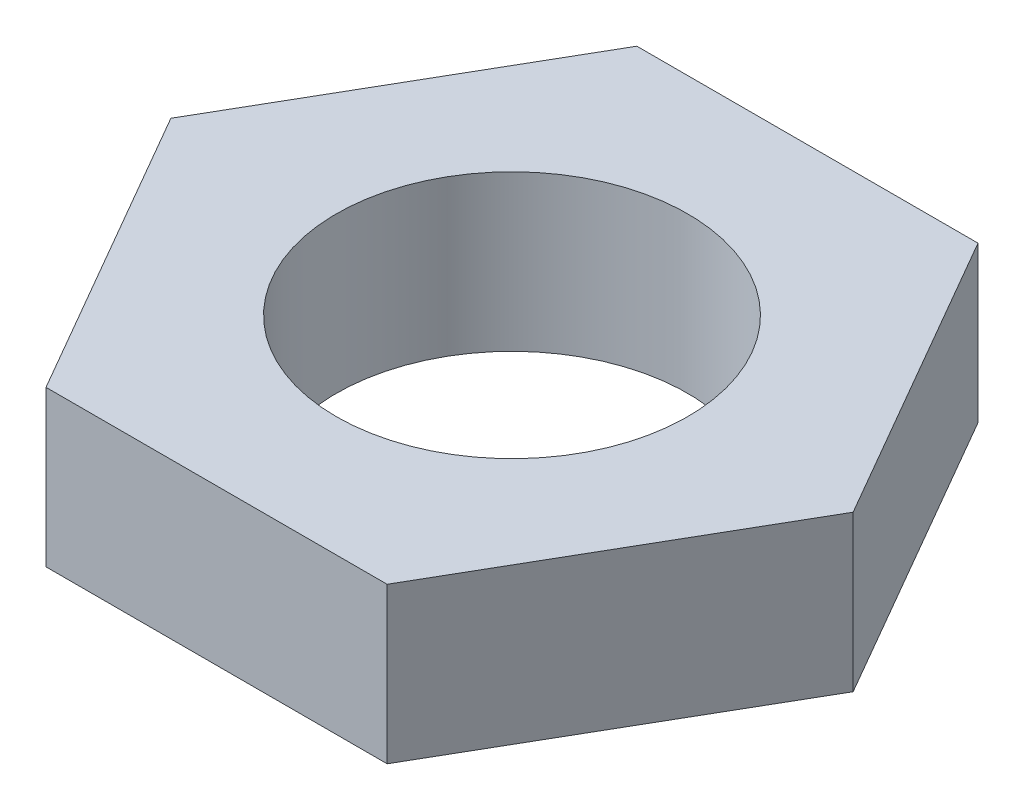
ISO-10303-21;
HEADER;
FILE_DESCRIPTION(('STEP AP214'),'2;1');
FILE_NAME('part.step','',(''),(''),'','','');
FILE_SCHEMA(('AUTOMOTIVE_DESIGN { 1 0 10303 214 1 1 1 1 }'));
ENDSEC;
DATA;
#1=APPLICATION_CONTEXT('core data for automotive mechanical design processes');
#2=APPLICATION_PROTOCOL_DEFINITION('international standard','automotive_design',2000,#1);
#3=PRODUCT_CONTEXT('',#1,'mechanical');
#4=PRODUCT('Part','Part','',(#3));
#5=PRODUCT_RELATED_PRODUCT_CATEGORY('part','',(#4));
#6=PRODUCT_DEFINITION_FORMATION('','',#4);
#7=PRODUCT_DEFINITION_CONTEXT('part definition',#1,'design');
#8=PRODUCT_DEFINITION('design','',#6,#7);
#9=PRODUCT_DEFINITION_SHAPE('','',#8);
#10=(LENGTH_UNIT() NAMED_UNIT(*) SI_UNIT(.MILLI.,.METRE.));
#11=(NAMED_UNIT(*) PLANE_ANGLE_UNIT() SI_UNIT($,.RADIAN.));
#12=(NAMED_UNIT(*) SI_UNIT($,.STERADIAN.) SOLID_ANGLE_UNIT());
#13=UNCERTAINTY_MEASURE_WITH_UNIT(LENGTH_MEASURE(1.E-05),#10,'distance_accuracy_value','');
#14=(GEOMETRIC_REPRESENTATION_CONTEXT(3) GLOBAL_UNCERTAINTY_ASSIGNED_CONTEXT((#13)) GLOBAL_UNIT_ASSIGNED_CONTEXT((#10,
#11,#12)) REPRESENTATION_CONTEXT('',''));
#15=CARTESIAN_POINT('',(0.,0.,0.));
#16=DIRECTION('',(0.,0.,1.));
#17=DIRECTION('',(1.,0.,0.));
#18=AXIS2_PLACEMENT_3D('',#15,#16,#17);
#19=CARTESIAN_POINT('',(5.48482755730144,5.,9.5));
#20=DIRECTION('',(0.,1.,0.));
#21=DIRECTION('',(0.,0.,1.));
#22=AXIS2_PLACEMENT_3D('',#19,#20,#21);
#23=PLANE('',#22);
#24=DIRECTION('',(1.,0.,0.));
#25=VECTOR('',#24,1.);
#26=CARTESIAN_POINT('',(-5.48482755730144,5.,9.5));
#27=LINE('',#26,#25);
#28=CARTESIAN_POINT('',(-5.48482755730144,5.,9.5));
#29=VERTEX_POINT('',#28);
#30=CARTESIAN_POINT('',(5.48482755730144,5.,9.5));
#31=VERTEX_POINT('',#30);
#32=EDGE_CURVE('E127',#29,#31,#27,.T.);
#33=ORIENTED_EDGE('',*,*,#32,.T.);
#34=DIRECTION('',(0.5,0.,-0.866025403784439));
#35=VECTOR('',#34,1.);
#36=CARTESIAN_POINT('',(5.48482755730144,5.,9.5));
#37=LINE('',#36,#35);
#38=CARTESIAN_POINT('',(10.9696551146029,5.,0.));
#39=VERTEX_POINT('',#38);
#40=EDGE_CURVE('E85',#31,#39,#37,.T.);
#41=ORIENTED_EDGE('',*,*,#40,.T.);
#42=DIRECTION('',(-0.5,0.,-0.866025403784438));
#43=VECTOR('',#42,1.);
#44=CARTESIAN_POINT('',(10.9696551146029,5.,0.));
#45=LINE('',#44,#43);
#46=CARTESIAN_POINT('',(5.48482755730144,5.,-9.5));
#47=VERTEX_POINT('',#46);
#48=EDGE_CURVE('E98',#39,#47,#45,.T.);
#49=ORIENTED_EDGE('',*,*,#48,.T.);
#50=DIRECTION('',(-1.,0.,0.));
#51=VECTOR('',#50,1.);
#52=CARTESIAN_POINT('',(5.48482755730144,5.,-9.5));
#53=LINE('',#52,#51);
#54=CARTESIAN_POINT('',(-5.48482755730144,5.,-9.5));
#55=VERTEX_POINT('',#54);
#56=EDGE_CURVE('E92',#47,#55,#53,.T.);
#57=ORIENTED_EDGE('',*,*,#56,.T.);
#58=DIRECTION('',(-0.5,0.,0.866025403784439));
#59=VECTOR('',#58,1.);
#60=CARTESIAN_POINT('',(-5.48482755730144,5.,-9.5));
#61=LINE('',#60,#59);
#62=CARTESIAN_POINT('',(-10.9696551146029,5.,0.));
#63=VERTEX_POINT('',#62);
#64=EDGE_CURVE('E96',#55,#63,#61,.T.);
#65=ORIENTED_EDGE('',*,*,#64,.T.);
#66=DIRECTION('',(0.5,0.,0.866025403784439));
#67=VECTOR('',#66,1.);
#68=CARTESIAN_POINT('',(-10.9696551146029,5.,0.));
#69=LINE('',#68,#67);
#70=EDGE_CURVE('E48',#63,#29,#69,.T.);
#71=ORIENTED_EDGE('',*,*,#70,.T.);
#72=EDGE_LOOP('',(#33,#41,#49,#57,#65,#71));
#73=FACE_BOUND('',#72,.T.);
#74=CARTESIAN_POINT('',(0.,5.,0.));
#75=DIRECTION('',(0.,1.,0.));
#76=DIRECTION('',(0.,0.,1.));
#77=AXIS2_PLACEMENT_3D('',#74,#75,#76);
#78=CIRCLE('',#77,5.65);
#79=CARTESIAN_POINT('',(0.,5.,5.65));
#80=VERTEX_POINT('',#79);
#81=EDGE_CURVE('E120',#80,#80,#78,.T.);
#82=ORIENTED_EDGE('',*,*,#81,.F.);
#83=EDGE_LOOP('',(#82));
#84=FACE_BOUND('',#83,.T.);
#85=ADVANCED_FACE('F31',(#73,#84),#23,.T.);
#86=CARTESIAN_POINT('',(5.48482755730144,0.,9.5));
#87=DIRECTION('',(0.,1.,0.));
#88=DIRECTION('',(0.,0.,1.));
#89=AXIS2_PLACEMENT_3D('',#86,#87,#88);
#90=PLANE('',#89);
#91=DIRECTION('',(1.,0.,0.));
#92=VECTOR('',#91,1.);
#93=CARTESIAN_POINT('',(-5.48482755730144,0.,9.5));
#94=LINE('',#93,#92);
#95=CARTESIAN_POINT('',(-5.48482755730144,0.,9.5));
#96=VERTEX_POINT('',#95);
#97=CARTESIAN_POINT('',(5.48482755730144,0.,9.5));
#98=VERTEX_POINT('',#97);
#99=EDGE_CURVE('E116',#96,#98,#94,.T.);
#100=ORIENTED_EDGE('',*,*,#99,.F.);
#101=DIRECTION('',(0.5,0.,0.866025403784439));
#102=VECTOR('',#101,1.);
#103=CARTESIAN_POINT('',(-10.9696551146029,0.,0.));
#104=LINE('',#103,#102);
#105=CARTESIAN_POINT('',(-10.9696551146029,0.,0.));
#106=VERTEX_POINT('',#105);
#107=EDGE_CURVE('E77',#106,#96,#104,.T.);
#108=ORIENTED_EDGE('',*,*,#107,.F.);
#109=DIRECTION('',(-0.5,0.,0.866025403784439));
#110=VECTOR('',#109,1.);
#111=CARTESIAN_POINT('',(-5.48482755730144,0.,-9.5));
#112=LINE('',#111,#110);
#113=CARTESIAN_POINT('',(-5.48482755730144,0.,-9.5));
#114=VERTEX_POINT('',#113);
#115=EDGE_CURVE('E71',#114,#106,#112,.T.);
#116=ORIENTED_EDGE('',*,*,#115,.F.);
#117=DIRECTION('',(-1.,0.,0.));
#118=VECTOR('',#117,1.);
#119=CARTESIAN_POINT('',(5.48482755730144,0.,-9.5));
#120=LINE('',#119,#118);
#121=CARTESIAN_POINT('',(5.48482755730144,0.,-9.5));
#122=VERTEX_POINT('',#121);
#123=EDGE_CURVE('E106',#122,#114,#120,.T.);
#124=ORIENTED_EDGE('',*,*,#123,.F.);
#125=DIRECTION('',(-0.5,0.,-0.866025403784438));
#126=VECTOR('',#125,1.);
#127=CARTESIAN_POINT('',(10.9696551146029,0.,0.));
#128=LINE('',#127,#126);
#129=CARTESIAN_POINT('',(10.9696551146029,0.,0.));
#130=VERTEX_POINT('',#129);
#131=EDGE_CURVE('E122',#130,#122,#128,.T.);
#132=ORIENTED_EDGE('',*,*,#131,.F.);
#133=DIRECTION('',(0.5,0.,-0.866025403784439));
#134=VECTOR('',#133,1.);
#135=CARTESIAN_POINT('',(5.48482755730144,0.,9.5));
#136=LINE('',#135,#134);
#137=EDGE_CURVE('E119',#98,#130,#136,.T.);
#138=ORIENTED_EDGE('',*,*,#137,.F.);
#139=EDGE_LOOP('',(#100,#108,#116,#124,#132,#138));
#140=FACE_BOUND('',#139,.T.);
#141=CARTESIAN_POINT('',(0.,0.,0.));
#142=DIRECTION('',(0.,1.,0.));
#143=DIRECTION('',(0.,0.,1.));
#144=AXIS2_PLACEMENT_3D('',#141,#142,#143);
#145=CIRCLE('',#144,5.65);
#146=CARTESIAN_POINT('',(0.,0.,5.65));
#147=VERTEX_POINT('',#146);
#148=EDGE_CURVE('E220',#147,#147,#145,.T.);
#149=ORIENTED_EDGE('',*,*,#148,.T.);
#150=EDGE_LOOP('',(#149));
#151=FACE_BOUND('',#150,.T.);
#152=ADVANCED_FACE('F136',(#140,#151),#90,.F.);
#153=CARTESIAN_POINT('',(-5.48482755730144,5.,9.5));
#154=DIRECTION('',(0.,0.,-1.));
#155=DIRECTION('',(-1.,0.,0.));
#156=AXIS2_PLACEMENT_3D('',#153,#154,#155);
#157=PLANE('',#156);
#158=ORIENTED_EDGE('',*,*,#99,.T.);
#159=DIRECTION('',(0.,-1.,0.));
#160=VECTOR('',#159,1.);
#161=CARTESIAN_POINT('',(5.48482755730144,5.,9.5));
#162=LINE('',#161,#160);
#163=EDGE_CURVE('E11',#31,#98,#162,.T.);
#164=ORIENTED_EDGE('',*,*,#163,.F.);
#165=ORIENTED_EDGE('',*,*,#32,.F.);
#166=DIRECTION('',(0.,-1.,0.));
#167=VECTOR('',#166,1.);
#168=CARTESIAN_POINT('',(-5.48482755730144,5.,9.5));
#169=LINE('',#168,#167);
#170=EDGE_CURVE('E112',#29,#96,#169,.T.);
#171=ORIENTED_EDGE('',*,*,#170,.T.);
#172=EDGE_LOOP('',(#158,#164,#165,#171));
#173=FACE_BOUND('',#172,.T.);
#174=ADVANCED_FACE('F33',(#173),#157,.F.);
#175=CARTESIAN_POINT('',(5.48482755730144,5.,9.5));
#176=DIRECTION('',(-0.866025403784439,0.,-0.5));
#177=DIRECTION('',(-0.5,0.,0.866025403784439));
#178=AXIS2_PLACEMENT_3D('',#175,#176,#177);
#179=PLANE('',#178);
#180=ORIENTED_EDGE('',*,*,#137,.T.);
#181=DIRECTION('',(0.,-1.,0.));
#182=VECTOR('',#181,1.);
#183=CARTESIAN_POINT('',(10.9696551146029,5.,0.));
#184=LINE('',#183,#182);
#185=EDGE_CURVE('E40',#39,#130,#184,.T.);
#186=ORIENTED_EDGE('',*,*,#185,.F.);
#187=ORIENTED_EDGE('',*,*,#40,.F.);
#188=ORIENTED_EDGE('',*,*,#163,.T.);
#189=EDGE_LOOP('',(#180,#186,#187,#188));
#190=FACE_BOUND('',#189,.T.);
#191=ADVANCED_FACE('F161',(#190),#179,.F.);
#192=CARTESIAN_POINT('',(10.9696551146029,5.,0.));
#193=DIRECTION('',(-0.866025403784438,0.,0.5));
#194=DIRECTION('',(0.5,0.,0.866025403784439));
#195=AXIS2_PLACEMENT_3D('',#192,#193,#194);
#196=PLANE('',#195);
#197=ORIENTED_EDGE('',*,*,#131,.T.);
#198=DIRECTION('',(0.,-1.,0.));
#199=VECTOR('',#198,1.);
#200=CARTESIAN_POINT('',(5.48482755730144,5.,-9.5));
#201=LINE('',#200,#199);
#202=EDGE_CURVE('E107',#47,#122,#201,.T.);
#203=ORIENTED_EDGE('',*,*,#202,.F.);
#204=ORIENTED_EDGE('',*,*,#48,.F.);
#205=ORIENTED_EDGE('',*,*,#185,.T.);
#206=EDGE_LOOP('',(#197,#203,#204,#205));
#207=FACE_BOUND('',#206,.T.);
#208=ADVANCED_FACE('F133',(#207),#196,.F.);
#209=CARTESIAN_POINT('',(5.48482755730144,5.,-9.5));
#210=DIRECTION('',(0.,0.,1.));
#211=DIRECTION('',(1.,0.,0.));
#212=AXIS2_PLACEMENT_3D('',#209,#210,#211);
#213=PLANE('',#212);
#214=ORIENTED_EDGE('',*,*,#123,.T.);
#215=DIRECTION('',(0.,-1.,0.));
#216=VECTOR('',#215,1.);
#217=CARTESIAN_POINT('',(-5.48482755730144,5.,-9.5));
#218=LINE('',#217,#216);
#219=EDGE_CURVE('E103',#55,#114,#218,.T.);
#220=ORIENTED_EDGE('',*,*,#219,.F.);
#221=ORIENTED_EDGE('',*,*,#56,.F.);
#222=ORIENTED_EDGE('',*,*,#202,.T.);
#223=EDGE_LOOP('',(#214,#220,#221,#222));
#224=FACE_BOUND('',#223,.T.);
#225=ADVANCED_FACE('F104',(#224),#213,.F.);
#226=CARTESIAN_POINT('',(-5.48482755730144,5.,-9.5));
#227=DIRECTION('',(0.866025403784439,0.,0.5));
#228=DIRECTION('',(0.5,0.,-0.866025403784439));
#229=AXIS2_PLACEMENT_3D('',#226,#227,#228);
#230=PLANE('',#229);
#231=ORIENTED_EDGE('',*,*,#115,.T.);
#232=DIRECTION('',(0.,-1.,0.));
#233=VECTOR('',#232,1.);
#234=CARTESIAN_POINT('',(-10.9696551146029,5.,0.));
#235=LINE('',#234,#233);
#236=EDGE_CURVE('E108',#63,#106,#235,.T.);
#237=ORIENTED_EDGE('',*,*,#236,.F.);
#238=ORIENTED_EDGE('',*,*,#64,.F.);
#239=ORIENTED_EDGE('',*,*,#219,.T.);
#240=EDGE_LOOP('',(#231,#237,#238,#239));
#241=FACE_BOUND('',#240,.T.);
#242=ADVANCED_FACE('F110',(#241),#230,.F.);
#243=CARTESIAN_POINT('',(-10.9696551146029,5.,0.));
#244=DIRECTION('',(0.866025403784439,0.,-0.5));
#245=DIRECTION('',(-0.5,0.,-0.866025403784439));
#246=AXIS2_PLACEMENT_3D('',#243,#244,#245);
#247=PLANE('',#246);
#248=ORIENTED_EDGE('',*,*,#107,.T.);
#249=ORIENTED_EDGE('',*,*,#170,.F.);
#250=ORIENTED_EDGE('',*,*,#70,.F.);
#251=ORIENTED_EDGE('',*,*,#236,.T.);
#252=EDGE_LOOP('',(#248,#249,#250,#251));
#253=FACE_BOUND('',#252,.T.);
#254=ADVANCED_FACE('F141',(#253),#247,.F.);
#255=CARTESIAN_POINT('',(0.,5.,0.));
#256=DIRECTION('',(0.,-1.,0.));
#257=DIRECTION('',(0.,0.,-1.));
#258=AXIS2_PLACEMENT_3D('',#255,#256,#257);
#259=CYLINDRICAL_SURFACE('',#258,5.65);
#260=ORIENTED_EDGE('',*,*,#81,.T.);
#261=EDGE_LOOP('',(#260));
#262=FACE_BOUND('',#261,.T.);
#263=ORIENTED_EDGE('',*,*,#148,.F.);
#264=EDGE_LOOP('',(#263));
#265=FACE_BOUND('',#264,.T.);
#266=ADVANCED_FACE('F143',(#262,#265),#259,.F.);
#267=CLOSED_SHELL('',(#85,#152,#174,#191,#208,#225,#242,#254,#266));
#268=MANIFOLD_SOLID_BREP('B2',#267);
#269=ADVANCED_BREP_SHAPE_REPRESENTATION('',(#18,#268),#14);
#270=SHAPE_DEFINITION_REPRESENTATION(#9,#269);
ENDSEC;
END-ISO-10303-21;
